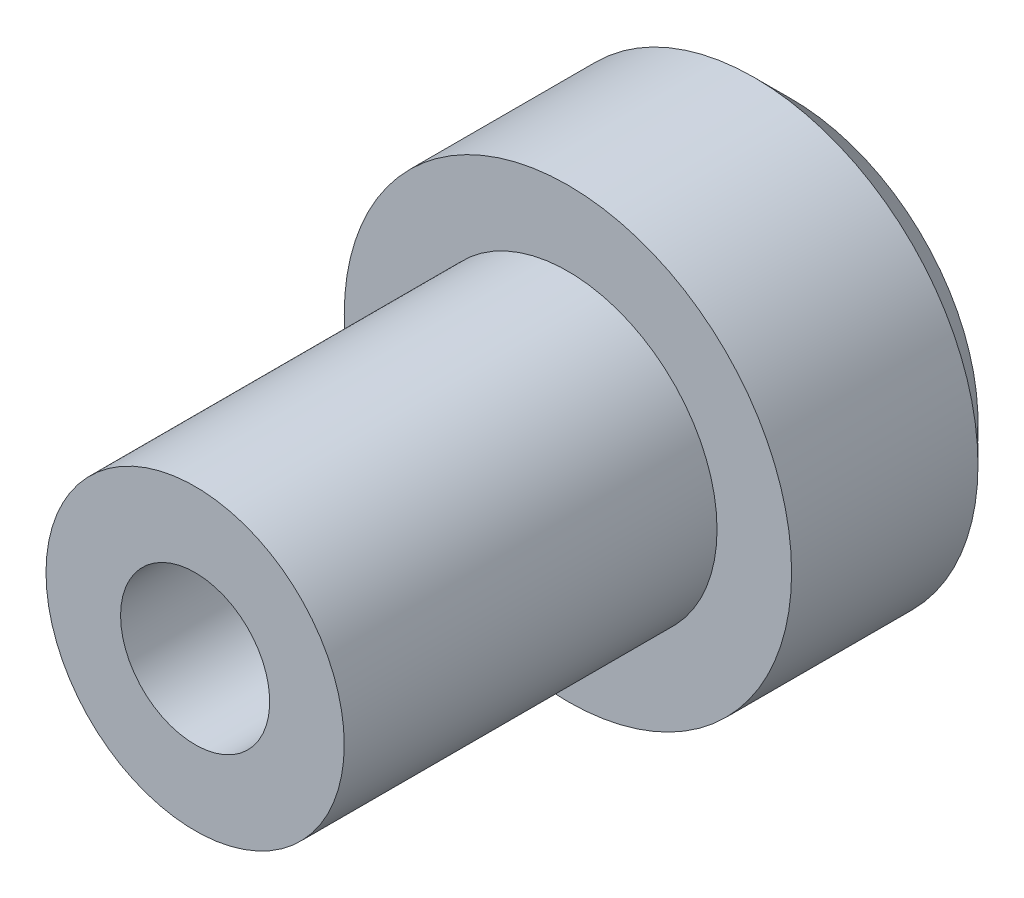
ISO-10303-21;
HEADER;
FILE_DESCRIPTION(('STEP AP214'),'2;1');
FILE_NAME('part.step','',(''),(''),'','','');
FILE_SCHEMA(('AUTOMOTIVE_DESIGN { 1 0 10303 214 1 1 1 1 }'));
ENDSEC;
DATA;
#1=APPLICATION_CONTEXT('core data for automotive mechanical design processes');
#2=APPLICATION_PROTOCOL_DEFINITION('international standard','automotive_design',2000,#1);
#3=PRODUCT_CONTEXT('',#1,'mechanical');
#4=PRODUCT('Part','Part','',(#3));
#5=PRODUCT_RELATED_PRODUCT_CATEGORY('part','',(#4));
#6=PRODUCT_DEFINITION_FORMATION('','',#4);
#7=PRODUCT_DEFINITION_CONTEXT('part definition',#1,'design');
#8=PRODUCT_DEFINITION('design','',#6,#7);
#9=PRODUCT_DEFINITION_SHAPE('','',#8);
#10=(LENGTH_UNIT() NAMED_UNIT(*) SI_UNIT(.MILLI.,.METRE.));
#11=(NAMED_UNIT(*) PLANE_ANGLE_UNIT() SI_UNIT($,.RADIAN.));
#12=(NAMED_UNIT(*) SI_UNIT($,.STERADIAN.) SOLID_ANGLE_UNIT());
#13=UNCERTAINTY_MEASURE_WITH_UNIT(LENGTH_MEASURE(1.E-05),#10,'distance_accuracy_value','');
#14=(GEOMETRIC_REPRESENTATION_CONTEXT(3) GLOBAL_UNCERTAINTY_ASSIGNED_CONTEXT((#13)) GLOBAL_UNIT_ASSIGNED_CONTEXT((#10,
#11,#12)) REPRESENTATION_CONTEXT('',''));
#15=CARTESIAN_POINT('',(0.,0.,0.));
#16=DIRECTION('',(0.,0.,1.));
#17=DIRECTION('',(1.,0.,0.));
#18=AXIS2_PLACEMENT_3D('',#15,#16,#17);
#19=CARTESIAN_POINT('',(0.,0.,-1.5));
#20=DIRECTION('',(0.,0.,-1.));
#21=DIRECTION('',(-1.,0.,0.));
#22=AXIS2_PLACEMENT_3D('',#19,#20,#21);
#23=PLANE('',#22);
#24=CARTESIAN_POINT('',(0.,0.,-1.5));
#25=DIRECTION('',(0.,0.,-1.));
#26=DIRECTION('',(-1.,0.,0.));
#27=AXIS2_PLACEMENT_3D('',#24,#25,#26);
#28=CIRCLE('',#27,1.);
#29=CARTESIAN_POINT('',(-1.,0.,-1.5));
#30=VERTEX_POINT('',#29);
#31=CARTESIAN_POINT('',(-0.5,0.866025403784438,-1.5));
#32=VERTEX_POINT('',#31);
#33=EDGE_CURVE('E107',#30,#32,#28,.T.);
#34=ORIENTED_EDGE('',*,*,#33,.F.);
#35=DIRECTION('',(0.,1.,0.));
#36=VECTOR('',#35,1.);
#37=CARTESIAN_POINT('',(-1.,-0.577350269189626,-1.5));
#38=LINE('',#37,#36);
#39=CARTESIAN_POINT('',(-1.,0.577350269189626,-1.5));
#40=VERTEX_POINT('',#39);
#41=EDGE_CURVE('E116',#30,#40,#38,.T.);
#42=ORIENTED_EDGE('',*,*,#41,.T.);
#43=DIRECTION('',(0.866025403784438,0.5,0.));
#44=VECTOR('',#43,1.);
#45=CARTESIAN_POINT('',(-1.,0.577350269189626,-1.5));
#46=LINE('',#45,#44);
#47=EDGE_CURVE('E119',#40,#32,#46,.T.);
#48=ORIENTED_EDGE('',*,*,#47,.T.);
#49=EDGE_LOOP('',(#34,#42,#48));
#50=FACE_BOUND('',#49,.T.);
#51=ADVANCED_FACE('F35',(#50),#23,.T.);
#52=CARTESIAN_POINT('',(0.5,0.866025403784438,-1.5));
#53=VERTEX_POINT('',#52);
#54=EDGE_CURVE('E121',#32,#53,#28,.T.);
#55=ORIENTED_EDGE('',*,*,#54,.F.);
#56=CARTESIAN_POINT('',(0.,1.15470053837925,-1.5));
#57=VERTEX_POINT('',#56);
#58=EDGE_CURVE('E133',#32,#57,#46,.T.);
#59=ORIENTED_EDGE('',*,*,#58,.T.);
#60=DIRECTION('',(0.866025403784439,-0.5,0.));
#61=VECTOR('',#60,1.);
#62=CARTESIAN_POINT('',(0.,1.15470053837925,-1.5));
#63=LINE('',#62,#61);
#64=EDGE_CURVE('E139',#57,#53,#63,.T.);
#65=ORIENTED_EDGE('',*,*,#64,.T.);
#66=EDGE_LOOP('',(#55,#59,#65));
#67=FACE_BOUND('',#66,.T.);
#68=ADVANCED_FACE('F200',(#67),#23,.T.);
#69=CARTESIAN_POINT('',(1.,0.,-1.5));
#70=VERTEX_POINT('',#69);
#71=EDGE_CURVE('E286',#53,#70,#28,.T.);
#72=ORIENTED_EDGE('',*,*,#71,.F.);
#73=CARTESIAN_POINT('',(1.,0.577350269189626,-1.5));
#74=VERTEX_POINT('',#73);
#75=EDGE_CURVE('E138',#53,#74,#63,.T.);
#76=ORIENTED_EDGE('',*,*,#75,.T.);
#77=DIRECTION('',(0.,-1.,0.));
#78=VECTOR('',#77,1.);
#79=CARTESIAN_POINT('',(1.,0.577350269189626,-1.5));
#80=LINE('',#79,#78);
#81=EDGE_CURVE('E143',#74,#70,#80,.T.);
#82=ORIENTED_EDGE('',*,*,#81,.T.);
#83=EDGE_LOOP('',(#72,#76,#82));
#84=FACE_BOUND('',#83,.T.);
#85=ADVANCED_FACE('F205',(#84),#23,.T.);
#86=CARTESIAN_POINT('',(0.5,-0.866025403784439,-1.5));
#87=VERTEX_POINT('',#86);
#88=EDGE_CURVE('E233',#70,#87,#28,.T.);
#89=ORIENTED_EDGE('',*,*,#88,.F.);
#90=CARTESIAN_POINT('',(1.,-0.577350269189626,-1.5));
#91=VERTEX_POINT('',#90);
#92=EDGE_CURVE('E142',#70,#91,#80,.T.);
#93=ORIENTED_EDGE('',*,*,#92,.T.);
#94=DIRECTION('',(-0.866025403784439,-0.5,0.));
#95=VECTOR('',#94,1.);
#96=CARTESIAN_POINT('',(1.,-0.577350269189626,-1.5));
#97=LINE('',#96,#95);
#98=EDGE_CURVE('E236',#91,#87,#97,.T.);
#99=ORIENTED_EDGE('',*,*,#98,.T.);
#100=EDGE_LOOP('',(#89,#93,#99));
#101=FACE_BOUND('',#100,.T.);
#102=ADVANCED_FACE('F221',(#101),#23,.T.);
#103=CARTESIAN_POINT('',(-0.5,-0.866025403784438,-1.5));
#104=VERTEX_POINT('',#103);
#105=EDGE_CURVE('E50',#87,#104,#28,.T.);
#106=ORIENTED_EDGE('',*,*,#105,.F.);
#107=CARTESIAN_POINT('',(0.,-1.15470053837925,-1.5));
#108=VERTEX_POINT('',#107);
#109=EDGE_CURVE('E162',#87,#108,#97,.T.);
#110=ORIENTED_EDGE('',*,*,#109,.T.);
#111=DIRECTION('',(-0.866025403784439,0.5,0.));
#112=VECTOR('',#111,1.);
#113=CARTESIAN_POINT('',(0.,-1.15470053837925,-1.5));
#114=LINE('',#113,#112);
#115=EDGE_CURVE('E128',#108,#104,#114,.T.);
#116=ORIENTED_EDGE('',*,*,#115,.T.);
#117=EDGE_LOOP('',(#106,#110,#116));
#118=FACE_BOUND('',#117,.T.);
#119=ADVANCED_FACE('F211',(#118),#23,.T.);
#120=CARTESIAN_POINT('',(0.,0.,5.));
#121=DIRECTION('',(0.,0.,-1.));
#122=DIRECTION('',(-1.,0.,0.));
#123=AXIS2_PLACEMENT_3D('',#120,#121,#122);
#124=CYLINDRICAL_SURFACE('',#123,2.);
#125=CARTESIAN_POINT('',(0.,0.,5.));
#126=DIRECTION('',(0.,0.,1.));
#127=DIRECTION('',(1.,0.,0.));
#128=AXIS2_PLACEMENT_3D('',#125,#126,#127);
#129=CIRCLE('',#128,2.);
#130=CARTESIAN_POINT('',(2.,0.,5.));
#131=VERTEX_POINT('',#130);
#132=EDGE_CURVE('E179',#131,#131,#129,.T.);
#133=ORIENTED_EDGE('',*,*,#132,.F.);
#134=EDGE_LOOP('',(#133));
#135=FACE_BOUND('',#134,.T.);
#136=CARTESIAN_POINT('',(0.,0.,0.));
#137=DIRECTION('',(0.,0.,-1.));
#138=DIRECTION('',(-1.,0.,0.));
#139=AXIS2_PLACEMENT_3D('',#136,#137,#138);
#140=CIRCLE('',#139,2.);
#141=CARTESIAN_POINT('',(-2.,0.,0.));
#142=VERTEX_POINT('',#141);
#143=EDGE_CURVE('E176',#142,#142,#140,.T.);
#144=ORIENTED_EDGE('',*,*,#143,.F.);
#145=EDGE_LOOP('',(#144));
#146=FACE_BOUND('',#145,.T.);
#147=ADVANCED_FACE('F220',(#135,#146),#124,.T.);
#148=CARTESIAN_POINT('',(0.,0.,5.));
#149=DIRECTION('',(0.,0.,1.));
#150=DIRECTION('',(1.,0.,0.));
#151=AXIS2_PLACEMENT_3D('',#148,#149,#150);
#152=PLANE('',#151);
#153=CARTESIAN_POINT('',(0.,0.,5.));
#154=DIRECTION('',(0.,0.,-1.));
#155=DIRECTION('',(-1.,0.,0.));
#156=AXIS2_PLACEMENT_3D('',#153,#154,#155);
#157=CIRCLE('',#156,1.);
#158=CARTESIAN_POINT('',(-1.,0.,5.));
#159=VERTEX_POINT('',#158);
#160=EDGE_CURVE('E120',#159,#159,#157,.T.);
#161=ORIENTED_EDGE('',*,*,#160,.T.);
#162=EDGE_LOOP('',(#161));
#163=FACE_BOUND('',#162,.T.);
#164=ORIENTED_EDGE('',*,*,#132,.T.);
#165=EDGE_LOOP('',(#164));
#166=FACE_BOUND('',#165,.T.);
#167=ADVANCED_FACE('F227',(#163,#166),#152,.T.);
#168=CARTESIAN_POINT('',(0.,0.,0.));
#169=DIRECTION('',(0.,0.,-1.));
#170=DIRECTION('',(-1.,0.,0.));
#171=AXIS2_PLACEMENT_3D('',#168,#169,#170);
#172=PLANE('',#171);
#173=CARTESIAN_POINT('',(0.,0.,0.));
#174=DIRECTION('',(0.,0.,-1.));
#175=DIRECTION('',(-1.,0.,0.));
#176=AXIS2_PLACEMENT_3D('',#173,#174,#175);
#177=CIRCLE('',#176,3.);
#178=CARTESIAN_POINT('',(-3.,0.,0.));
#179=VERTEX_POINT('',#178);
#180=EDGE_CURVE('E165',#179,#179,#177,.T.);
#181=ORIENTED_EDGE('',*,*,#180,.F.);
#182=EDGE_LOOP('',(#181));
#183=FACE_BOUND('',#182,.T.);
#184=ORIENTED_EDGE('',*,*,#143,.T.);
#185=EDGE_LOOP('',(#184));
#186=FACE_BOUND('',#185,.T.);
#187=ADVANCED_FACE('F246',(#183,#186),#172,.F.);
#188=CARTESIAN_POINT('',(0.,0.,-3.));
#189=DIRECTION('',(0.,0.,1.));
#190=DIRECTION('',(1.,0.,0.));
#191=AXIS2_PLACEMENT_3D('',#188,#189,#190);
#192=CYLINDRICAL_SURFACE('',#191,3.);
#193=CARTESIAN_POINT('',(0.,0.,-2.5));
#194=DIRECTION('',(0.,0.,-1.));
#195=DIRECTION('',(-1.,0.,0.));
#196=AXIS2_PLACEMENT_3D('',#193,#194,#195);
#197=CIRCLE('',#196,3.);
#198=CARTESIAN_POINT('',(-3.,0.,-2.5));
#199=VERTEX_POINT('',#198);
#200=EDGE_CURVE('E11',#199,#199,#197,.F.);
#201=ORIENTED_EDGE('',*,*,#200,.T.);
#202=EDGE_LOOP('',(#201));
#203=FACE_BOUND('',#202,.T.);
#204=ORIENTED_EDGE('',*,*,#180,.T.);
#205=EDGE_LOOP('',(#204));
#206=FACE_BOUND('',#205,.T.);
#207=ADVANCED_FACE('F195',(#203,#206),#192,.T.);
#208=CARTESIAN_POINT('',(0.,0.,-3.));
#209=DIRECTION('',(0.,0.,-1.));
#210=DIRECTION('',(-1.,0.,0.));
#211=AXIS2_PLACEMENT_3D('',#208,#209,#210);
#212=PLANE('',#211);
#213=DIRECTION('',(-0.866025403784439,-0.5,0.));
#214=VECTOR('',#213,1.);
#215=CARTESIAN_POINT('',(1.,-0.577350269189626,-3.));
#216=LINE('',#215,#214);
#217=CARTESIAN_POINT('',(1.,-0.577350269189626,-3.));
#218=VERTEX_POINT('',#217);
#219=CARTESIAN_POINT('',(0.,-1.15470053837925,-3.));
#220=VERTEX_POINT('',#219);
#221=EDGE_CURVE('E58',#218,#220,#216,.T.);
#222=ORIENTED_EDGE('',*,*,#221,.F.);
#223=DIRECTION('',(0.,-1.,0.));
#224=VECTOR('',#223,1.);
#225=CARTESIAN_POINT('',(1.,0.577350269189626,-3.));
#226=LINE('',#225,#224);
#227=CARTESIAN_POINT('',(1.,0.577350269189626,-3.));
#228=VERTEX_POINT('',#227);
#229=EDGE_CURVE('E159',#228,#218,#226,.T.);
#230=ORIENTED_EDGE('',*,*,#229,.F.);
#231=DIRECTION('',(0.866025403784439,-0.5,0.));
#232=VECTOR('',#231,1.);
#233=CARTESIAN_POINT('',(0.,1.15470053837925,-3.));
#234=LINE('',#233,#232);
#235=CARTESIAN_POINT('',(0.,1.15470053837925,-3.));
#236=VERTEX_POINT('',#235);
#237=EDGE_CURVE('E156',#236,#228,#234,.T.);
#238=ORIENTED_EDGE('',*,*,#237,.F.);
#239=DIRECTION('',(0.866025403784438,0.5,0.));
#240=VECTOR('',#239,1.);
#241=CARTESIAN_POINT('',(-1.,0.577350269189626,-3.));
#242=LINE('',#241,#240);
#243=CARTESIAN_POINT('',(-1.,0.577350269189626,-3.));
#244=VERTEX_POINT('',#243);
#245=EDGE_CURVE('E153',#244,#236,#242,.T.);
#246=ORIENTED_EDGE('',*,*,#245,.F.);
#247=DIRECTION('',(0.,1.,0.));
#248=VECTOR('',#247,1.);
#249=CARTESIAN_POINT('',(-1.,-0.577350269189626,-3.));
#250=LINE('',#249,#248);
#251=CARTESIAN_POINT('',(-1.,-0.577350269189626,-3.));
#252=VERTEX_POINT('',#251);
#253=EDGE_CURVE('E151',#252,#244,#250,.T.);
#254=ORIENTED_EDGE('',*,*,#253,.F.);
#255=DIRECTION('',(-0.866025403784439,0.5,0.));
#256=VECTOR('',#255,1.);
#257=CARTESIAN_POINT('',(0.,-1.15470053837925,-3.));
#258=LINE('',#257,#256);
#259=EDGE_CURVE('E148',#220,#252,#258,.T.);
#260=ORIENTED_EDGE('',*,*,#259,.F.);
#261=EDGE_LOOP('',(#222,#230,#238,#246,#254,#260));
#262=FACE_BOUND('',#261,.T.);
#263=CARTESIAN_POINT('',(0.,0.,-3.));
#264=DIRECTION('',(0.,0.,-1.));
#265=DIRECTION('',(-1.,0.,0.));
#266=AXIS2_PLACEMENT_3D('',#263,#264,#265);
#267=CIRCLE('',#266,2.5);
#268=CARTESIAN_POINT('',(-2.5,0.,-3.));
#269=VERTEX_POINT('',#268);
#270=EDGE_CURVE('E43',#269,#269,#267,.T.);
#271=ORIENTED_EDGE('',*,*,#270,.T.);
#272=EDGE_LOOP('',(#271));
#273=FACE_BOUND('',#272,.T.);
#274=ADVANCED_FACE('F184',(#262,#273),#212,.T.);
#275=CARTESIAN_POINT('',(0.,0.,-3.));
#276=DIRECTION('',(0.,0.,1.));
#277=DIRECTION('',(1.,0.,0.));
#278=AXIS2_PLACEMENT_3D('',#275,#276,#277);
#279=CONICAL_SURFACE('',#278,2.5,0.785398163397446);
#280=ORIENTED_EDGE('',*,*,#200,.F.);
#281=EDGE_LOOP('',(#280));
#282=FACE_BOUND('',#281,.T.);
#283=ORIENTED_EDGE('',*,*,#270,.F.);
#284=EDGE_LOOP('',(#283));
#285=FACE_BOUND('',#284,.T.);
#286=ADVANCED_FACE('F37',(#282,#285),#279,.T.);
#287=CARTESIAN_POINT('',(1.,-0.577350269189626,-1.5));
#288=DIRECTION('',(0.5,-0.866025403784438,0.));
#289=DIRECTION('',(0.866025403784439,0.5,0.));
#290=AXIS2_PLACEMENT_3D('',#287,#288,#289);
#291=PLANE('',#290);
#292=ORIENTED_EDGE('',*,*,#221,.T.);
#293=DIRECTION('',(0.,0.,-1.));
#294=VECTOR('',#293,1.);
#295=CARTESIAN_POINT('',(0.,-1.15470053837925,-1.5));
#296=LINE('',#295,#294);
#297=EDGE_CURVE('E146',#108,#220,#296,.T.);
#298=ORIENTED_EDGE('',*,*,#297,.F.);
#299=ORIENTED_EDGE('',*,*,#109,.F.);
#300=ORIENTED_EDGE('',*,*,#98,.F.);
#301=DIRECTION('',(0.,0.,-1.));
#302=VECTOR('',#301,1.);
#303=CARTESIAN_POINT('',(1.,-0.577350269189626,-1.5));
#304=LINE('',#303,#302);
#305=EDGE_CURVE('E163',#91,#218,#304,.T.);
#306=ORIENTED_EDGE('',*,*,#305,.T.);
#307=EDGE_LOOP('',(#292,#298,#299,#300,#306));
#308=FACE_BOUND('',#307,.T.);
#309=ADVANCED_FACE('F187',(#308),#291,.F.);
#310=CARTESIAN_POINT('',(1.,0.577350269189626,-1.5));
#311=DIRECTION('',(1.,0.,0.));
#312=DIRECTION('',(0.,0.,-1.));
#313=AXIS2_PLACEMENT_3D('',#310,#311,#312);
#314=PLANE('',#313);
#315=ORIENTED_EDGE('',*,*,#229,.T.);
#316=ORIENTED_EDGE('',*,*,#305,.F.);
#317=ORIENTED_EDGE('',*,*,#92,.F.);
#318=ORIENTED_EDGE('',*,*,#81,.F.);
#319=DIRECTION('',(0.,0.,-1.));
#320=VECTOR('',#319,1.);
#321=CARTESIAN_POINT('',(1.,0.577350269189626,-1.5));
#322=LINE('',#321,#320);
#323=EDGE_CURVE('E166',#74,#228,#322,.T.);
#324=ORIENTED_EDGE('',*,*,#323,.T.);
#325=EDGE_LOOP('',(#315,#316,#317,#318,#324));
#326=FACE_BOUND('',#325,.T.);
#327=ADVANCED_FACE('F193',(#326),#314,.F.);
#328=CARTESIAN_POINT('',(0.,1.15470053837925,-1.5));
#329=DIRECTION('',(0.5,0.866025403784438,0.));
#330=DIRECTION('',(-0.866025403784439,0.5,0.));
#331=AXIS2_PLACEMENT_3D('',#328,#329,#330);
#332=PLANE('',#331);
#333=ORIENTED_EDGE('',*,*,#237,.T.);
#334=ORIENTED_EDGE('',*,*,#323,.F.);
#335=ORIENTED_EDGE('',*,*,#75,.F.);
#336=ORIENTED_EDGE('',*,*,#64,.F.);
#337=DIRECTION('',(0.,0.,-1.));
#338=VECTOR('',#337,1.);
#339=CARTESIAN_POINT('',(0.,1.15470053837925,-1.5));
#340=LINE('',#339,#338);
#341=EDGE_CURVE('E168',#57,#236,#340,.T.);
#342=ORIENTED_EDGE('',*,*,#341,.T.);
#343=EDGE_LOOP('',(#333,#334,#335,#336,#342));
#344=FACE_BOUND('',#343,.T.);
#345=ADVANCED_FACE('F267',(#344),#332,.F.);
#346=CARTESIAN_POINT('',(-1.,0.577350269189626,-1.5));
#347=DIRECTION('',(-0.5,0.866025403784438,0.));
#348=DIRECTION('',(-0.866025403784439,-0.5,0.));
#349=AXIS2_PLACEMENT_3D('',#346,#347,#348);
#350=PLANE('',#349);
#351=ORIENTED_EDGE('',*,*,#245,.T.);
#352=ORIENTED_EDGE('',*,*,#341,.F.);
#353=ORIENTED_EDGE('',*,*,#58,.F.);
#354=ORIENTED_EDGE('',*,*,#47,.F.);
#355=DIRECTION('',(0.,0.,-1.));
#356=VECTOR('',#355,1.);
#357=CARTESIAN_POINT('',(-1.,0.577350269189626,-1.5));
#358=LINE('',#357,#356);
#359=EDGE_CURVE('E127',#40,#244,#358,.T.);
#360=ORIENTED_EDGE('',*,*,#359,.T.);
#361=EDGE_LOOP('',(#351,#352,#353,#354,#360));
#362=FACE_BOUND('',#361,.T.);
#363=ADVANCED_FACE('F264',(#362),#350,.F.);
#364=CARTESIAN_POINT('',(-1.,-0.577350269189626,-1.5));
#365=DIRECTION('',(-1.,0.,0.));
#366=DIRECTION('',(0.,0.,1.));
#367=AXIS2_PLACEMENT_3D('',#364,#365,#366);
#368=PLANE('',#367);
#369=ORIENTED_EDGE('',*,*,#253,.T.);
#370=ORIENTED_EDGE('',*,*,#359,.F.);
#371=ORIENTED_EDGE('',*,*,#41,.F.);
#372=CARTESIAN_POINT('',(-1.,-0.577350269189626,-1.5));
#373=VERTEX_POINT('',#372);
#374=EDGE_CURVE('E126',#373,#30,#38,.T.);
#375=ORIENTED_EDGE('',*,*,#374,.F.);
#376=DIRECTION('',(0.,0.,-1.));
#377=VECTOR('',#376,1.);
#378=CARTESIAN_POINT('',(-1.,-0.577350269189626,-1.5));
#379=LINE('',#378,#377);
#380=EDGE_CURVE('E171',#373,#252,#379,.T.);
#381=ORIENTED_EDGE('',*,*,#380,.T.);
#382=EDGE_LOOP('',(#369,#370,#371,#375,#381));
#383=FACE_BOUND('',#382,.T.);
#384=ADVANCED_FACE('F125',(#383),#368,.F.);
#385=CARTESIAN_POINT('',(0.,-1.15470053837925,-1.5));
#386=DIRECTION('',(-0.5,-0.866025403784439,0.));
#387=DIRECTION('',(0.866025403784439,-0.5,0.));
#388=AXIS2_PLACEMENT_3D('',#385,#386,#387);
#389=PLANE('',#388);
#390=ORIENTED_EDGE('',*,*,#259,.T.);
#391=ORIENTED_EDGE('',*,*,#380,.F.);
#392=EDGE_CURVE('E131',#104,#373,#114,.T.);
#393=ORIENTED_EDGE('',*,*,#392,.F.);
#394=ORIENTED_EDGE('',*,*,#115,.F.);
#395=ORIENTED_EDGE('',*,*,#297,.T.);
#396=EDGE_LOOP('',(#390,#391,#393,#394,#395));
#397=FACE_BOUND('',#396,.T.);
#398=ADVANCED_FACE('F210',(#397),#389,.F.);
#399=EDGE_CURVE('E104',#104,#30,#28,.T.);
#400=ORIENTED_EDGE('',*,*,#399,.F.);
#401=ORIENTED_EDGE('',*,*,#392,.T.);
#402=ORIENTED_EDGE('',*,*,#374,.T.);
#403=EDGE_LOOP('',(#400,#401,#402));
#404=FACE_BOUND('',#403,.T.);
#405=ADVANCED_FACE('F130',(#404),#23,.T.);
#406=CARTESIAN_POINT('',(0.,0.,5.));
#407=DIRECTION('',(0.,0.,-1.));
#408=DIRECTION('',(-1.,0.,0.));
#409=AXIS2_PLACEMENT_3D('',#406,#407,#408);
#410=CYLINDRICAL_SURFACE('',#409,1.);
#411=ORIENTED_EDGE('',*,*,#160,.F.);
#412=EDGE_LOOP('',(#411));
#413=FACE_BOUND('',#412,.T.);
#414=ORIENTED_EDGE('',*,*,#33,.T.);
#415=ORIENTED_EDGE('',*,*,#54,.T.);
#416=ORIENTED_EDGE('',*,*,#71,.T.);
#417=ORIENTED_EDGE('',*,*,#88,.T.);
#418=ORIENTED_EDGE('',*,*,#105,.T.);
#419=ORIENTED_EDGE('',*,*,#399,.T.);
#420=EDGE_LOOP('',(#414,#415,#416,#417,#418,#419));
#421=FACE_BOUND('',#420,.T.);
#422=ADVANCED_FACE('F106',(#413,#421),#410,.F.);
#423=CLOSED_SHELL('',(#51,#68,#85,#102,#119,#147,#167,#187,#207,#274,#286,#309,#327,#345,#363,
#384,#398,#405,#422));
#424=MANIFOLD_SOLID_BREP('B2',#423);
#425=ADVANCED_BREP_SHAPE_REPRESENTATION('',(#18,#424),#14);
#426=SHAPE_DEFINITION_REPRESENTATION(#9,#425);
ENDSEC;
END-ISO-10303-21;
